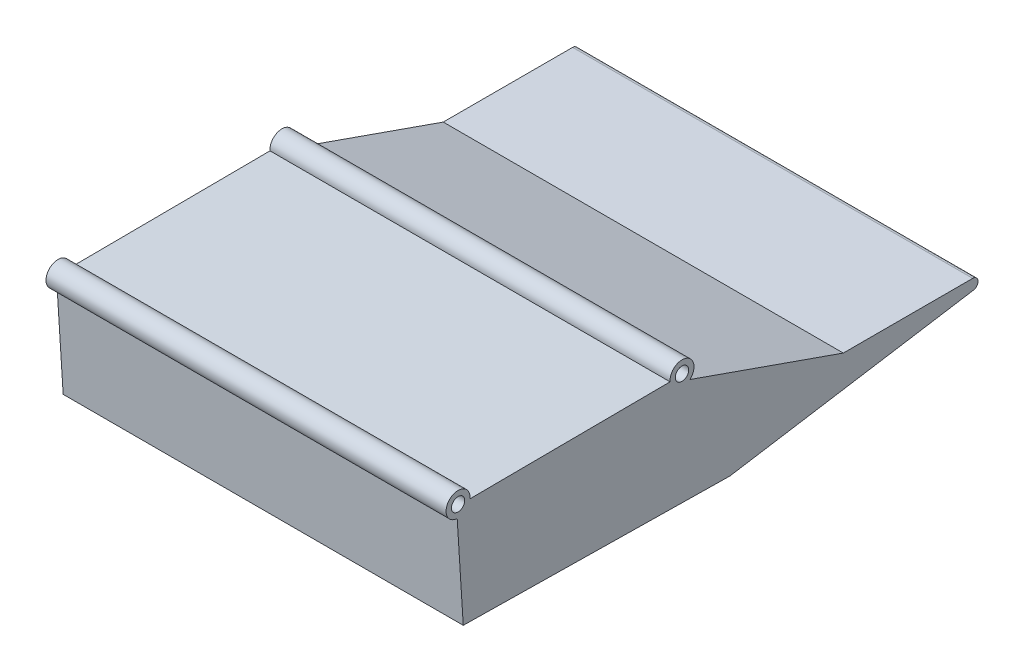
ISO-10303-21;
HEADER;
FILE_DESCRIPTION(('STEP AP214'),'2;1');
FILE_NAME('part.step','',(''),(''),'','','');
FILE_SCHEMA(('AUTOMOTIVE_DESIGN { 1 0 10303 214 1 1 1 1 }'));
ENDSEC;
DATA;
#1=APPLICATION_CONTEXT('core data for automotive mechanical design processes');
#2=APPLICATION_PROTOCOL_DEFINITION('international standard','automotive_design',2000,#1);
#3=PRODUCT_CONTEXT('',#1,'mechanical');
#4=PRODUCT('Part','Part','',(#3));
#5=PRODUCT_RELATED_PRODUCT_CATEGORY('part','',(#4));
#6=PRODUCT_DEFINITION_FORMATION('','',#4);
#7=PRODUCT_DEFINITION_CONTEXT('part definition',#1,'design');
#8=PRODUCT_DEFINITION('design','',#6,#7);
#9=PRODUCT_DEFINITION_SHAPE('','',#8);
#10=(LENGTH_UNIT() NAMED_UNIT(*) SI_UNIT(.MILLI.,.METRE.));
#11=(NAMED_UNIT(*) PLANE_ANGLE_UNIT() SI_UNIT($,.RADIAN.));
#12=(NAMED_UNIT(*) SI_UNIT($,.STERADIAN.) SOLID_ANGLE_UNIT());
#13=UNCERTAINTY_MEASURE_WITH_UNIT(LENGTH_MEASURE(1.E-05),#10,'distance_accuracy_value','');
#14=(GEOMETRIC_REPRESENTATION_CONTEXT(3) GLOBAL_UNCERTAINTY_ASSIGNED_CONTEXT((#13)) GLOBAL_UNIT_ASSIGNED_CONTEXT((#10,
#11,#12)) REPRESENTATION_CONTEXT('',''));
#15=CARTESIAN_POINT('',(0.,0.,0.));
#16=DIRECTION('',(0.,0.,1.));
#17=DIRECTION('',(1.,0.,0.));
#18=AXIS2_PLACEMENT_3D('',#15,#16,#17);
#19=CARTESIAN_POINT('',(75.,22.860150941764,17.9777203051586));
#20=DIRECTION('',(1.,0.,0.));
#21=DIRECTION('',(0.,0.,-1.));
#22=AXIS2_PLACEMENT_3D('',#19,#20,#21);
#23=PLANE('',#22);
#24=CARTESIAN_POINT('',(75.,22.4298083695565,101.937720305159));
#25=DIRECTION('',(1.,0.,0.));
#26=DIRECTION('',(0.,0.,-1.));
#27=AXIS2_PLACEMENT_3D('',#24,#25,#26);
#28=CIRCLE('',#27,2.50000000000104);
#29=CARTESIAN_POINT('',(75.,22.4298083695565,99.4377203051575));
#30=VERTEX_POINT('',#29);
#31=EDGE_CURVE('E196',#30,#30,#28,.T.);
#32=ORIENTED_EDGE('',*,*,#31,.F.);
#33=EDGE_LOOP('',(#32));
#34=FACE_BOUND('',#33,.T.);
#35=DIRECTION('',(0.,0.158828499061568,-0.987306187505097));
#36=VECTOR('',#35,1.);
#37=CARTESIAN_POINT('',(75.,-0.683058505558384,-116.020534247298));
#38=LINE('',#37,#36);
#39=CARTESIAN_POINT('',(75.,-19.3473467962915,0.));
#40=VERTEX_POINT('',#39);
#41=CARTESIAN_POINT('',(75.,-4.65767088056858,-91.3136370974315));
#42=VERTEX_POINT('',#41);
#43=EDGE_CURVE('E127',#40,#42,#38,.T.);
#44=ORIENTED_EDGE('',*,*,#43,.T.);
#45=CARTESIAN_POINT('',(75.,-2.68305850555838,-90.9959800993083));
#46=DIRECTION('',(1.,0.,0.));
#47=DIRECTION('',(0.,0.,-1.));
#48=AXIS2_PLACEMENT_3D('',#45,#46,#47);
#49=CIRCLE('',#48,2.);
#50=CARTESIAN_POINT('',(75.,-0.683058505558384,-90.9959800993083));
#51=VERTEX_POINT('',#50);
#52=EDGE_CURVE('E11',#42,#51,#49,.T.);
#53=ORIENTED_EDGE('',*,*,#52,.T.);
#54=DIRECTION('',(0.,0.,1.));
#55=VECTOR('',#54,1.);
#56=CARTESIAN_POINT('',(75.,-0.683058505558384,-42.4967456058965));
#57=LINE('',#56,#55);
#58=CARTESIAN_POINT('',(75.,-0.683058505558384,-42.4967456058965));
#59=VERTEX_POINT('',#58);
#60=EDGE_CURVE('E208',#51,#59,#57,.T.);
#61=ORIENTED_EDGE('',*,*,#60,.T.);
#62=DIRECTION('',(0.,0.330897731555963,0.943666620820678));
#63=VECTOR('',#62,1.);
#64=CARTESIAN_POINT('',(75.,-0.683058505558384,-42.4967456058965));
#65=LINE('',#64,#63);
#66=CARTESIAN_POINT('',(75.,19.4805204706128,15.006508788207));
#67=VERTEX_POINT('',#66);
#68=EDGE_CURVE('E205',#59,#67,#65,.T.);
#69=ORIENTED_EDGE('',*,*,#68,.T.);
#70=CARTESIAN_POINT('',(75.,22.860150941764,17.9777203051586));
#71=DIRECTION('',(1.,0.,0.));
#72=DIRECTION('',(0.,0.,-1.));
#73=AXIS2_PLACEMENT_3D('',#70,#71,#72);
#74=CIRCLE('',#73,4.5);
#75=CARTESIAN_POINT('',(75.,22.4502485428296,22.4590125321114));
#76=VERTEX_POINT('',#75);
#77=EDGE_CURVE('E202',#67,#76,#74,.T.);
#78=ORIENTED_EDGE('',*,*,#77,.T.);
#79=DIRECTION('',(0.,-0.0063307871288791,0.999979960366371));
#80=VECTOR('',#79,1.);
#81=CARTESIAN_POINT('',(75.,22.4502485428296,22.4590125321114));
#82=LINE('',#81,#80);
#83=CARTESIAN_POINT('',(75.,21.9754191822465,97.4607201413809));
#84=VERTEX_POINT('',#83);
#85=EDGE_CURVE('E199',#76,#84,#82,.T.);
#86=ORIENTED_EDGE('',*,*,#85,.T.);
#87=CARTESIAN_POINT('',(75.,22.4298083695565,101.937720305159));
#88=DIRECTION('',(1.,0.,0.));
#89=DIRECTION('',(0.,0.,-1.));
#90=AXIS2_PLACEMENT_3D('',#87,#88,#89);
#91=CIRCLE('',#90,4.50000000000104);
#92=CARTESIAN_POINT('',(75.,17.9419438891467,102.267981422285));
#93=VERTEX_POINT('',#92);
#94=EDGE_CURVE('E133',#84,#93,#91,.T.);
#95=ORIENTED_EDGE('',*,*,#94,.T.);
#96=DIRECTION('',(0.,-0.997998203091604,-0.0632422851099517));
#97=VECTOR('',#96,1.);
#98=CARTESIAN_POINT('',(75.,17.9419438891467,102.267981422285));
#99=LINE('',#98,#97);
#100=CARTESIAN_POINT('',(75.,-17.8480561108533,100.));
#101=VERTEX_POINT('',#100);
#102=EDGE_CURVE('E128',#93,#101,#99,.T.);
#103=ORIENTED_EDGE('',*,*,#102,.T.);
#104=DIRECTION('',(0.,-0.0149912220312256,-0.999887625316971));
#105=VECTOR('',#104,1.);
#106=CARTESIAN_POINT('',(75.,-17.8480561108533,100.));
#107=LINE('',#106,#105);
#108=EDGE_CURVE('E117',#101,#40,#107,.T.);
#109=ORIENTED_EDGE('',*,*,#108,.T.);
#110=EDGE_LOOP('',(#44,#53,#61,#69,#78,#86,#95,#103,#109));
#111=FACE_BOUND('',#110,.T.);
#112=CARTESIAN_POINT('',(75.,22.860150941764,17.9777203051586));
#113=DIRECTION('',(1.,0.,0.));
#114=DIRECTION('',(0.,0.,-1.));
#115=AXIS2_PLACEMENT_3D('',#112,#113,#114);
#116=CIRCLE('',#115,2.5);
#117=CARTESIAN_POINT('',(75.,22.860150941764,15.4777203051586));
#118=VERTEX_POINT('',#117);
#119=EDGE_CURVE('E217',#118,#118,#116,.T.);
#120=ORIENTED_EDGE('',*,*,#119,.F.);
#121=EDGE_LOOP('',(#120));
#122=FACE_BOUND('',#121,.T.);
#123=ADVANCED_FACE('F45',(#34,#111,#122),#23,.T.);
#124=CARTESIAN_POINT('',(-75.,22.860150941764,17.9777203051586));
#125=DIRECTION('',(1.,0.,0.));
#126=DIRECTION('',(0.,0.,-1.));
#127=AXIS2_PLACEMENT_3D('',#124,#125,#126);
#128=PLANE('',#127);
#129=DIRECTION('',(0.,0.,1.));
#130=VECTOR('',#129,1.);
#131=CARTESIAN_POINT('',(-75.,-0.683058505558384,-42.4967456058965));
#132=LINE('',#131,#130);
#133=CARTESIAN_POINT('',(-75.,-0.683058505558384,-90.9959800993083));
#134=VERTEX_POINT('',#133);
#135=CARTESIAN_POINT('',(-75.,-0.683058505558384,-42.4967456058965));
#136=VERTEX_POINT('',#135);
#137=EDGE_CURVE('E185',#134,#136,#132,.T.);
#138=ORIENTED_EDGE('',*,*,#137,.F.);
#139=CARTESIAN_POINT('',(-75.,-2.68305850555838,-90.9959800993083));
#140=DIRECTION('',(1.,0.,0.));
#141=DIRECTION('',(0.,0.,-1.));
#142=AXIS2_PLACEMENT_3D('',#139,#140,#141);
#143=CIRCLE('',#142,2.);
#144=CARTESIAN_POINT('',(-75.,-4.65767088056858,-91.3136370974315));
#145=VERTEX_POINT('',#144);
#146=EDGE_CURVE('E68',#134,#145,#143,.F.);
#147=ORIENTED_EDGE('',*,*,#146,.T.);
#148=DIRECTION('',(0.,0.158828499061568,-0.987306187505097));
#149=VECTOR('',#148,1.);
#150=CARTESIAN_POINT('',(-75.,-0.683058505558384,-116.020534247298));
#151=LINE('',#150,#149);
#152=CARTESIAN_POINT('',(-75.,-19.3473467962915,0.));
#153=VERTEX_POINT('',#152);
#154=EDGE_CURVE('E188',#153,#145,#151,.T.);
#155=ORIENTED_EDGE('',*,*,#154,.F.);
#156=DIRECTION('',(0.,-0.0149912220312256,-0.999887625316971));
#157=VECTOR('',#156,1.);
#158=CARTESIAN_POINT('',(-75.,-17.8480561108533,100.));
#159=LINE('',#158,#157);
#160=CARTESIAN_POINT('',(-75.,-17.8480561108533,100.));
#161=VERTEX_POINT('',#160);
#162=EDGE_CURVE('E191',#161,#153,#159,.T.);
#163=ORIENTED_EDGE('',*,*,#162,.F.);
#164=DIRECTION('',(0.,-0.997998203091604,-0.0632422851099517));
#165=VECTOR('',#164,1.);
#166=CARTESIAN_POINT('',(-75.,17.9419438891467,102.267981422285));
#167=LINE('',#166,#165);
#168=CARTESIAN_POINT('',(-75.,17.9419438891467,102.267981422285));
#169=VERTEX_POINT('',#168);
#170=EDGE_CURVE('E142',#169,#161,#167,.T.);
#171=ORIENTED_EDGE('',*,*,#170,.F.);
#172=CARTESIAN_POINT('',(-75.,22.4298083695565,101.937720305159));
#173=DIRECTION('',(1.,0.,0.));
#174=DIRECTION('',(0.,0.,-1.));
#175=AXIS2_PLACEMENT_3D('',#172,#173,#174);
#176=CIRCLE('',#175,4.50000000000104);
#177=CARTESIAN_POINT('',(-75.,21.9754191822465,97.4607201413809));
#178=VERTEX_POINT('',#177);
#179=EDGE_CURVE('E138',#178,#169,#176,.T.);
#180=ORIENTED_EDGE('',*,*,#179,.F.);
#181=DIRECTION('',(0.,-0.0063307871288791,0.999979960366371));
#182=VECTOR('',#181,1.);
#183=CARTESIAN_POINT('',(-75.,22.4502485428296,22.4590125321114));
#184=LINE('',#183,#182);
#185=CARTESIAN_POINT('',(-75.,22.4502485428296,22.4590125321114));
#186=VERTEX_POINT('',#185);
#187=EDGE_CURVE('E176',#186,#178,#184,.T.);
#188=ORIENTED_EDGE('',*,*,#187,.F.);
#189=CARTESIAN_POINT('',(-75.,22.860150941764,17.9777203051586));
#190=DIRECTION('',(1.,0.,0.));
#191=DIRECTION('',(0.,0.,-1.));
#192=AXIS2_PLACEMENT_3D('',#189,#190,#191);
#193=CIRCLE('',#192,4.5);
#194=CARTESIAN_POINT('',(-75.,19.4805204706128,15.006508788207));
#195=VERTEX_POINT('',#194);
#196=EDGE_CURVE('E179',#195,#186,#193,.T.);
#197=ORIENTED_EDGE('',*,*,#196,.F.);
#198=DIRECTION('',(0.,0.330897731555963,0.943666620820678));
#199=VECTOR('',#198,1.);
#200=CARTESIAN_POINT('',(-75.,-0.683058505558384,-42.4967456058965));
#201=LINE('',#200,#199);
#202=EDGE_CURVE('E182',#136,#195,#201,.T.);
#203=ORIENTED_EDGE('',*,*,#202,.F.);
#204=EDGE_LOOP('',(#138,#147,#155,#163,#171,#180,#188,#197,#203));
#205=FACE_BOUND('',#204,.T.);
#206=CARTESIAN_POINT('',(-75.,22.4298083695565,101.937720305159));
#207=DIRECTION('',(1.,0.,0.));
#208=DIRECTION('',(0.,0.,-1.));
#209=AXIS2_PLACEMENT_3D('',#206,#207,#208);
#210=CIRCLE('',#209,2.50000000000104);
#211=CARTESIAN_POINT('',(-75.,22.4298083695565,99.4377203051575));
#212=VERTEX_POINT('',#211);
#213=EDGE_CURVE('E213',#212,#212,#210,.T.);
#214=ORIENTED_EDGE('',*,*,#213,.T.);
#215=EDGE_LOOP('',(#214));
#216=FACE_BOUND('',#215,.T.);
#217=CARTESIAN_POINT('',(-75.,22.860150941764,17.9777203051586));
#218=DIRECTION('',(1.,0.,0.));
#219=DIRECTION('',(0.,0.,-1.));
#220=AXIS2_PLACEMENT_3D('',#217,#218,#219);
#221=CIRCLE('',#220,2.5);
#222=CARTESIAN_POINT('',(-75.,22.860150941764,15.4777203051586));
#223=VERTEX_POINT('',#222);
#224=EDGE_CURVE('E221',#223,#223,#221,.T.);
#225=ORIENTED_EDGE('',*,*,#224,.T.);
#226=EDGE_LOOP('',(#225));
#227=FACE_BOUND('',#226,.T.);
#228=ADVANCED_FACE('F232',(#205,#216,#227),#128,.F.);
#229=CARTESIAN_POINT('',(75.,17.9419438891467,102.267981422285));
#230=DIRECTION('',(0.,0.0632422851099517,-0.997998203091605));
#231=DIRECTION('',(0.,0.997998203091605,0.0632422851099517));
#232=AXIS2_PLACEMENT_3D('',#229,#230,#231);
#233=PLANE('',#232);
#234=ORIENTED_EDGE('',*,*,#170,.T.);
#235=DIRECTION('',(-1.,0.,0.));
#236=VECTOR('',#235,1.);
#237=CARTESIAN_POINT('',(75.,-17.8480561108533,100.));
#238=LINE('',#237,#236);
#239=EDGE_CURVE('E121',#101,#161,#238,.T.);
#240=ORIENTED_EDGE('',*,*,#239,.F.);
#241=ORIENTED_EDGE('',*,*,#102,.F.);
#242=DIRECTION('',(-1.,0.,0.));
#243=VECTOR('',#242,1.);
#244=CARTESIAN_POINT('',(75.,17.9419438891467,102.267981422285));
#245=LINE('',#244,#243);
#246=EDGE_CURVE('E171',#93,#169,#245,.T.);
#247=ORIENTED_EDGE('',*,*,#246,.T.);
#248=EDGE_LOOP('',(#234,#240,#241,#247));
#249=FACE_BOUND('',#248,.T.);
#250=ADVANCED_FACE('F140',(#249),#233,.F.);
#251=CARTESIAN_POINT('',(75.,-17.8480561108533,100.));
#252=DIRECTION('',(0.,0.999887625316971,-0.0149912220312256));
#253=DIRECTION('',(0.,0.0149912220312256,0.999887625316971));
#254=AXIS2_PLACEMENT_3D('',#251,#252,#253);
#255=PLANE('',#254);
#256=ORIENTED_EDGE('',*,*,#162,.T.);
#257=DIRECTION('',(-1.,0.,0.));
#258=VECTOR('',#257,1.);
#259=CARTESIAN_POINT('',(75.,-19.3473467962915,0.));
#260=LINE('',#259,#258);
#261=EDGE_CURVE('E124',#40,#153,#260,.T.);
#262=ORIENTED_EDGE('',*,*,#261,.F.);
#263=ORIENTED_EDGE('',*,*,#108,.F.);
#264=ORIENTED_EDGE('',*,*,#239,.T.);
#265=EDGE_LOOP('',(#256,#262,#263,#264));
#266=FACE_BOUND('',#265,.T.);
#267=ADVANCED_FACE('F119',(#266),#255,.F.);
#268=CARTESIAN_POINT('',(75.,-0.683058505558384,-116.020534247298));
#269=DIRECTION('',(0.,0.987306187505097,0.158828499061568));
#270=DIRECTION('',(0.,-0.158828499061568,0.987306187505097));
#271=AXIS2_PLACEMENT_3D('',#268,#269,#270);
#272=PLANE('',#271);
#273=ORIENTED_EDGE('',*,*,#154,.T.);
#274=DIRECTION('',(-1.,0.,0.));
#275=VECTOR('',#274,1.);
#276=CARTESIAN_POINT('',(75.,-4.65767088056858,-91.3136370974315));
#277=LINE('',#276,#275);
#278=EDGE_CURVE('E54',#145,#42,#277,.F.);
#279=ORIENTED_EDGE('',*,*,#278,.T.);
#280=ORIENTED_EDGE('',*,*,#43,.F.);
#281=ORIENTED_EDGE('',*,*,#261,.T.);
#282=EDGE_LOOP('',(#273,#279,#280,#281));
#283=FACE_BOUND('',#282,.T.);
#284=ADVANCED_FACE('F263',(#283),#272,.F.);
#285=CARTESIAN_POINT('',(75.,-0.683058505558384,-42.4967456058965));
#286=DIRECTION('',(0.,-1.,0.));
#287=DIRECTION('',(0.,0.,-1.));
#288=AXIS2_PLACEMENT_3D('',#285,#286,#287);
#289=PLANE('',#288);
#290=ORIENTED_EDGE('',*,*,#60,.F.);
#291=DIRECTION('',(-1.,0.,0.));
#292=VECTOR('',#291,1.);
#293=CARTESIAN_POINT('',(75.,-0.683058505558384,-90.9959800993083));
#294=LINE('',#293,#292);
#295=EDGE_CURVE('E144',#51,#134,#294,.T.);
#296=ORIENTED_EDGE('',*,*,#295,.T.);
#297=ORIENTED_EDGE('',*,*,#137,.T.);
#298=DIRECTION('',(-1.,0.,0.));
#299=VECTOR('',#298,1.);
#300=CARTESIAN_POINT('',(75.,-0.683058505558384,-42.4967456058965));
#301=LINE('',#300,#299);
#302=EDGE_CURVE('E150',#59,#136,#301,.T.);
#303=ORIENTED_EDGE('',*,*,#302,.F.);
#304=EDGE_LOOP('',(#290,#296,#297,#303));
#305=FACE_BOUND('',#304,.T.);
#306=ADVANCED_FACE('F259',(#305),#289,.F.);
#307=CARTESIAN_POINT('',(75.,-0.683058505558384,-42.4967456058965));
#308=DIRECTION('',(0.,-0.943666620820678,0.330897731555963));
#309=DIRECTION('',(0.,-0.330897731555963,-0.943666620820678));
#310=AXIS2_PLACEMENT_3D('',#307,#308,#309);
#311=PLANE('',#310);
#312=ORIENTED_EDGE('',*,*,#202,.T.);
#313=DIRECTION('',(-1.,0.,0.));
#314=VECTOR('',#313,1.);
#315=CARTESIAN_POINT('',(75.,19.4805204706128,15.006508788207));
#316=LINE('',#315,#314);
#317=EDGE_CURVE('E159',#67,#195,#316,.T.);
#318=ORIENTED_EDGE('',*,*,#317,.F.);
#319=ORIENTED_EDGE('',*,*,#68,.F.);
#320=ORIENTED_EDGE('',*,*,#302,.T.);
#321=EDGE_LOOP('',(#312,#318,#319,#320));
#322=FACE_BOUND('',#321,.T.);
#323=ADVANCED_FACE('F255',(#322),#311,.F.);
#324=CARTESIAN_POINT('',(75.,22.860150941764,17.9777203051586));
#325=DIRECTION('',(-1.,0.,0.));
#326=DIRECTION('',(0.,0.,1.));
#327=AXIS2_PLACEMENT_3D('',#324,#325,#326);
#328=CYLINDRICAL_SURFACE('',#327,4.5);
#329=ORIENTED_EDGE('',*,*,#196,.T.);
#330=DIRECTION('',(-1.,0.,0.));
#331=VECTOR('',#330,1.);
#332=CARTESIAN_POINT('',(75.,22.4502485428296,22.4590125321114));
#333=LINE('',#332,#331);
#334=EDGE_CURVE('E163',#76,#186,#333,.T.);
#335=ORIENTED_EDGE('',*,*,#334,.F.);
#336=ORIENTED_EDGE('',*,*,#77,.F.);
#337=ORIENTED_EDGE('',*,*,#317,.T.);
#338=EDGE_LOOP('',(#329,#335,#336,#337));
#339=FACE_BOUND('',#338,.T.);
#340=ADVANCED_FACE('F251',(#339),#328,.T.);
#341=CARTESIAN_POINT('',(75.,22.4502485428296,22.4590125321114));
#342=DIRECTION('',(0.,-0.999979960366371,-0.0063307871288791));
#343=DIRECTION('',(0.,0.0063307871288791,-0.999979960366371));
#344=AXIS2_PLACEMENT_3D('',#341,#342,#343);
#345=PLANE('',#344);
#346=ORIENTED_EDGE('',*,*,#187,.T.);
#347=DIRECTION('',(-1.,0.,0.));
#348=VECTOR('',#347,1.);
#349=CARTESIAN_POINT('',(75.,21.9754191822465,97.4607201413809));
#350=LINE('',#349,#348);
#351=EDGE_CURVE('E167',#84,#178,#350,.T.);
#352=ORIENTED_EDGE('',*,*,#351,.F.);
#353=ORIENTED_EDGE('',*,*,#85,.F.);
#354=ORIENTED_EDGE('',*,*,#334,.T.);
#355=EDGE_LOOP('',(#346,#352,#353,#354));
#356=FACE_BOUND('',#355,.T.);
#357=ADVANCED_FACE('F247',(#356),#345,.F.);
#358=CARTESIAN_POINT('',(75.,22.4298083695565,101.937720305159));
#359=DIRECTION('',(-1.,0.,0.));
#360=DIRECTION('',(0.,0.,1.));
#361=AXIS2_PLACEMENT_3D('',#358,#359,#360);
#362=CYLINDRICAL_SURFACE('',#361,4.50000000000104);
#363=ORIENTED_EDGE('',*,*,#179,.T.);
#364=ORIENTED_EDGE('',*,*,#246,.F.);
#365=ORIENTED_EDGE('',*,*,#94,.F.);
#366=ORIENTED_EDGE('',*,*,#351,.T.);
#367=EDGE_LOOP('',(#363,#364,#365,#366));
#368=FACE_BOUND('',#367,.T.);
#369=ADVANCED_FACE('F244',(#368),#362,.T.);
#370=CARTESIAN_POINT('',(75.,22.4298083695565,101.937720305159));
#371=DIRECTION('',(-1.,0.,0.));
#372=DIRECTION('',(0.,0.,1.));
#373=AXIS2_PLACEMENT_3D('',#370,#371,#372);
#374=CYLINDRICAL_SURFACE('',#373,2.50000000000104);
#375=ORIENTED_EDGE('',*,*,#31,.T.);
#376=EDGE_LOOP('',(#375));
#377=FACE_BOUND('',#376,.T.);
#378=ORIENTED_EDGE('',*,*,#213,.F.);
#379=EDGE_LOOP('',(#378));
#380=FACE_BOUND('',#379,.T.);
#381=ADVANCED_FACE('F241',(#377,#380),#374,.F.);
#382=CARTESIAN_POINT('',(75.,22.860150941764,17.9777203051586));
#383=DIRECTION('',(-1.,0.,0.));
#384=DIRECTION('',(0.,0.,1.));
#385=AXIS2_PLACEMENT_3D('',#382,#383,#384);
#386=CYLINDRICAL_SURFACE('',#385,2.5);
#387=ORIENTED_EDGE('',*,*,#119,.T.);
#388=EDGE_LOOP('',(#387));
#389=FACE_BOUND('',#388,.T.);
#390=ORIENTED_EDGE('',*,*,#224,.F.);
#391=EDGE_LOOP('',(#390));
#392=FACE_BOUND('',#391,.T.);
#393=ADVANCED_FACE('F229',(#389,#392),#386,.F.);
#394=CARTESIAN_POINT('',(75.,-2.68305850555838,-90.9959800993083));
#395=DIRECTION('',(-1.,0.,0.));
#396=DIRECTION('',(0.,0.,1.));
#397=AXIS2_PLACEMENT_3D('',#394,#395,#396);
#398=CYLINDRICAL_SURFACE('',#397,2.);
#399=ORIENTED_EDGE('',*,*,#52,.F.);
#400=ORIENTED_EDGE('',*,*,#278,.F.);
#401=ORIENTED_EDGE('',*,*,#146,.F.);
#402=ORIENTED_EDGE('',*,*,#295,.F.);
#403=EDGE_LOOP('',(#399,#400,#401,#402));
#404=FACE_BOUND('',#403,.T.);
#405=ADVANCED_FACE('F47',(#404),#398,.T.);
#406=CLOSED_SHELL('',(#123,#228,#250,#267,#284,#306,#323,#340,#357,#369,#381,#393,#405));
#407=MANIFOLD_SOLID_BREP('B2',#406);
#408=ADVANCED_BREP_SHAPE_REPRESENTATION('',(#18,#407),#14);
#409=SHAPE_DEFINITION_REPRESENTATION(#9,#408);
ENDSEC;
END-ISO-10303-21;
